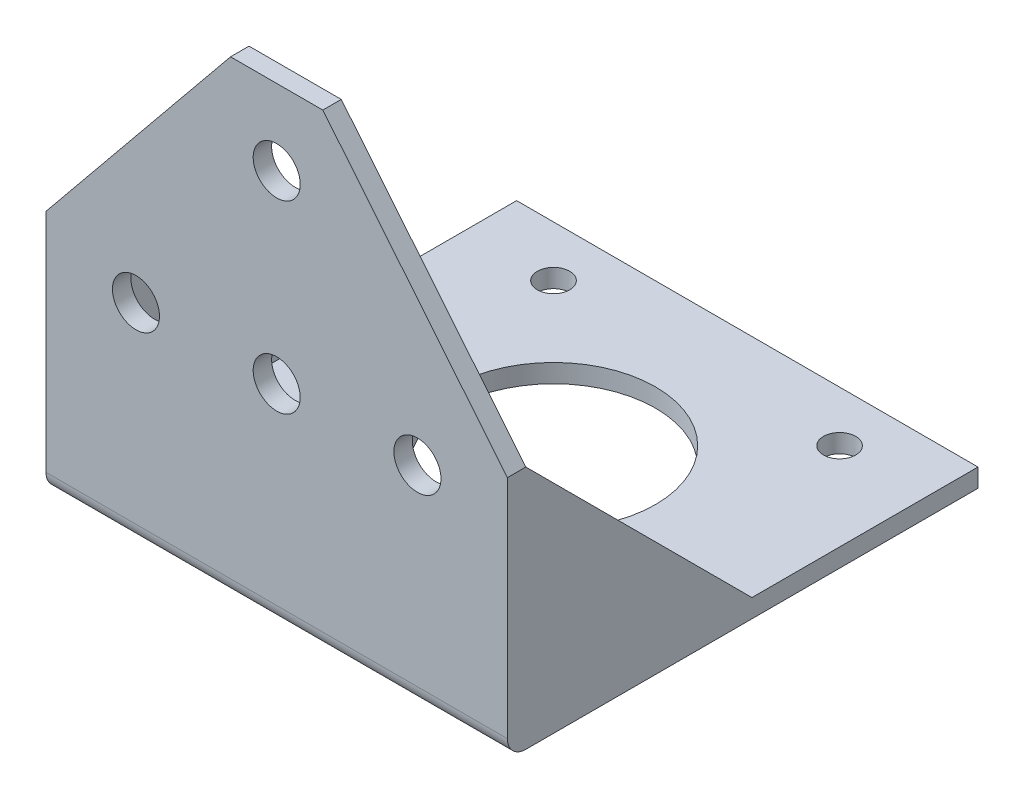
ISO-10303-21;
HEADER;
FILE_DESCRIPTION(('STEP AP214'),'2;1');
FILE_NAME('part.step','',(''),(''),'','','');
FILE_SCHEMA(('AUTOMOTIVE_DESIGN { 1 0 10303 214 1 1 1 1 }'));
ENDSEC;
DATA;
#1=APPLICATION_CONTEXT('core data for automotive mechanical design processes');
#2=APPLICATION_PROTOCOL_DEFINITION('international standard','automotive_design',2000,#1);
#3=PRODUCT_CONTEXT('',#1,'mechanical');
#4=PRODUCT('Part','Part','',(#3));
#5=PRODUCT_RELATED_PRODUCT_CATEGORY('part','',(#4));
#6=PRODUCT_DEFINITION_FORMATION('','',#4);
#7=PRODUCT_DEFINITION_CONTEXT('part definition',#1,'design');
#8=PRODUCT_DEFINITION('design','',#6,#7);
#9=PRODUCT_DEFINITION_SHAPE('','',#8);
#10=(LENGTH_UNIT() NAMED_UNIT(*) SI_UNIT(.MILLI.,.METRE.));
#11=(NAMED_UNIT(*) PLANE_ANGLE_UNIT() SI_UNIT($,.RADIAN.));
#12=(NAMED_UNIT(*) SI_UNIT($,.STERADIAN.) SOLID_ANGLE_UNIT());
#13=UNCERTAINTY_MEASURE_WITH_UNIT(LENGTH_MEASURE(1.E-05),#10,'distance_accuracy_value','');
#14=(GEOMETRIC_REPRESENTATION_CONTEXT(3) GLOBAL_UNCERTAINTY_ASSIGNED_CONTEXT((#13)) GLOBAL_UNIT_ASSIGNED_CONTEXT((#10,
#11,#12)) REPRESENTATION_CONTEXT('',''));
#15=CARTESIAN_POINT('',(0.,0.,0.));
#16=DIRECTION('',(0.,0.,1.));
#17=DIRECTION('',(1.,0.,0.));
#18=AXIS2_PLACEMENT_3D('',#15,#16,#17);
#19=CARTESIAN_POINT('',(25.,2.,-21.));
#20=DIRECTION('',(-1.,0.,0.));
#21=DIRECTION('',(0.,0.,1.));
#22=AXIS2_PLACEMENT_3D('',#19,#20,#21);
#23=PLANE('',#22);
#24=DIRECTION('',(0.,0.,-1.));
#25=VECTOR('',#24,1.);
#26=CARTESIAN_POINT('',(25.,26.5,30.));
#27=LINE('',#26,#25);
#28=CARTESIAN_POINT('',(25.,26.5,30.));
#29=VERTEX_POINT('',#28);
#30=CARTESIAN_POINT('',(25.,26.5,28.));
#31=VERTEX_POINT('',#30);
#32=EDGE_CURVE('E291',#29,#31,#27,.T.);
#33=ORIENTED_EDGE('',*,*,#32,.F.);
#34=DIRECTION('',(0.,-1.,0.));
#35=VECTOR('',#34,1.);
#36=CARTESIAN_POINT('',(25.,2.,30.));
#37=LINE('',#36,#35);
#38=CARTESIAN_POINT('',(25.,2.,30.));
#39=VERTEX_POINT('',#38);
#40=EDGE_CURVE('E154',#29,#39,#37,.T.);
#41=ORIENTED_EDGE('',*,*,#40,.T.);
#42=CARTESIAN_POINT('',(25.,2.,28.));
#43=DIRECTION('',(-1.,0.,0.));
#44=DIRECTION('',(0.,0.,1.));
#45=AXIS2_PLACEMENT_3D('',#42,#43,#44);
#46=CIRCLE('',#45,2.);
#47=CARTESIAN_POINT('',(25.,0.,28.));
#48=VERTEX_POINT('',#47);
#49=EDGE_CURVE('E184',#39,#48,#46,.F.);
#50=ORIENTED_EDGE('',*,*,#49,.T.);
#51=DIRECTION('',(0.,0.,-1.));
#52=VECTOR('',#51,1.);
#53=CARTESIAN_POINT('',(25.,0.,-21.));
#54=LINE('',#53,#52);
#55=CARTESIAN_POINT('',(25.,0.,-21.));
#56=VERTEX_POINT('',#55);
#57=EDGE_CURVE('E182',#48,#56,#54,.T.);
#58=ORIENTED_EDGE('',*,*,#57,.T.);
#59=DIRECTION('',(0.,-1.,0.));
#60=VECTOR('',#59,1.);
#61=CARTESIAN_POINT('',(25.,2.,-21.));
#62=LINE('',#61,#60);
#63=CARTESIAN_POINT('',(25.,2.,-21.));
#64=VERTEX_POINT('',#63);
#65=EDGE_CURVE('E157',#64,#56,#62,.T.);
#66=ORIENTED_EDGE('',*,*,#65,.F.);
#67=DIRECTION('',(0.,0.,-1.));
#68=VECTOR('',#67,1.);
#69=CARTESIAN_POINT('',(25.,2.,-21.));
#70=LINE('',#69,#68);
#71=CARTESIAN_POINT('',(25.,2.,3.5));
#72=VERTEX_POINT('',#71);
#73=EDGE_CURVE('E268',#72,#64,#70,.T.);
#74=ORIENTED_EDGE('',*,*,#73,.F.);
#75=DIRECTION('',(0.,0.707106781186547,0.707106781186547));
#76=VECTOR('',#75,1.);
#77=CARTESIAN_POINT('',(25.,26.5,28.));
#78=LINE('',#77,#76);
#79=EDGE_CURVE('E239',#72,#31,#78,.T.);
#80=ORIENTED_EDGE('',*,*,#79,.T.);
#81=EDGE_LOOP('',(#33,#41,#50,#58,#66,#74,#80));
#82=FACE_BOUND('',#81,.T.);
#83=ADVANCED_FACE('F35',(#82),#23,.F.);
#84=CARTESIAN_POINT('',(-25.,2.,30.));
#85=DIRECTION('',(0.,0.,-1.));
#86=DIRECTION('',(-1.,0.,0.));
#87=AXIS2_PLACEMENT_3D('',#84,#85,#86);
#88=PLANE('',#87);
#89=CARTESIAN_POINT('',(0.,22.8,30.));
#90=DIRECTION('',(0.,0.,-1.));
#91=DIRECTION('',(-1.,0.,0.));
#92=AXIS2_PLACEMENT_3D('',#89,#90,#91);
#93=CIRCLE('',#92,2.55);
#94=CARTESIAN_POINT('',(-2.55,22.8,30.));
#95=VERTEX_POINT('',#94);
#96=EDGE_CURVE('E229',#95,#95,#93,.T.);
#97=ORIENTED_EDGE('',*,*,#96,.T.);
#98=EDGE_LOOP('',(#97));
#99=FACE_BOUND('',#98,.T.);
#100=CARTESIAN_POINT('',(15.25,22.8,30.));
#101=DIRECTION('',(0.,0.,-1.));
#102=DIRECTION('',(1.,0.,0.));
#103=AXIS2_PLACEMENT_3D('',#100,#101,#102);
#104=CIRCLE('',#103,2.55);
#105=CARTESIAN_POINT('',(17.8,22.8,30.));
#106=VERTEX_POINT('',#105);
#107=EDGE_CURVE('E301',#106,#106,#104,.T.);
#108=ORIENTED_EDGE('',*,*,#107,.T.);
#109=EDGE_LOOP('',(#108));
#110=FACE_BOUND('',#109,.T.);
#111=CARTESIAN_POINT('',(0.,42.8,30.));
#112=DIRECTION('',(0.,0.,-1.));
#113=DIRECTION('',(-1.,0.,0.));
#114=AXIS2_PLACEMENT_3D('',#111,#112,#113);
#115=CIRCLE('',#114,2.55);
#116=CARTESIAN_POINT('',(-2.55000000000001,42.8,30.));
#117=VERTEX_POINT('',#116);
#118=EDGE_CURVE('E307',#117,#117,#115,.T.);
#119=ORIENTED_EDGE('',*,*,#118,.T.);
#120=EDGE_LOOP('',(#119));
#121=FACE_BOUND('',#120,.T.);
#122=CARTESIAN_POINT('',(-15.25,22.8,30.));
#123=DIRECTION('',(0.,0.,-1.));
#124=DIRECTION('',(-1.,0.,0.));
#125=AXIS2_PLACEMENT_3D('',#122,#123,#124);
#126=CIRCLE('',#125,2.55);
#127=CARTESIAN_POINT('',(-17.8,22.8,30.));
#128=VERTEX_POINT('',#127);
#129=EDGE_CURVE('E313',#128,#128,#126,.T.);
#130=ORIENTED_EDGE('',*,*,#129,.T.);
#131=EDGE_LOOP('',(#130));
#132=FACE_BOUND('',#131,.T.);
#133=DIRECTION('',(1.,0.,0.));
#134=VECTOR('',#133,1.);
#135=CARTESIAN_POINT('',(-25.,51.,30.));
#136=LINE('',#135,#134);
#137=CARTESIAN_POINT('',(-5.,51.,30.));
#138=VERTEX_POINT('',#137);
#139=CARTESIAN_POINT('',(5.,51.,30.));
#140=VERTEX_POINT('',#139);
#141=EDGE_CURVE('E146',#138,#140,#136,.T.);
#142=ORIENTED_EDGE('',*,*,#141,.F.);
#143=DIRECTION('',(-0.632376489912261,-0.774661200142519,0.));
#144=VECTOR('',#143,1.);
#145=CARTESIAN_POINT('',(-27.9842539365159,22.8442889277681,30.));
#146=LINE('',#145,#144);
#147=CARTESIAN_POINT('',(-25.,26.5,30.));
#148=VERTEX_POINT('',#147);
#149=EDGE_CURVE('E58',#138,#148,#146,.T.);
#150=ORIENTED_EDGE('',*,*,#149,.T.);
#151=DIRECTION('',(0.,-1.,0.));
#152=VECTOR('',#151,1.);
#153=CARTESIAN_POINT('',(-25.,2.,30.));
#154=LINE('',#153,#152);
#155=CARTESIAN_POINT('',(-25.,2.,30.));
#156=VERTEX_POINT('',#155);
#157=EDGE_CURVE('E142',#148,#156,#154,.T.);
#158=ORIENTED_EDGE('',*,*,#157,.T.);
#159=DIRECTION('',(1.,0.,0.));
#160=VECTOR('',#159,1.);
#161=CARTESIAN_POINT('',(-25.,2.,30.));
#162=LINE('',#161,#160);
#163=EDGE_CURVE('E165',#156,#39,#162,.T.);
#164=ORIENTED_EDGE('',*,*,#163,.T.);
#165=ORIENTED_EDGE('',*,*,#40,.F.);
#166=DIRECTION('',(0.632376489912261,-0.77466120014252,0.));
#167=VECTOR('',#166,1.);
#168=CARTESIAN_POINT('',(27.9842539365159,22.8442889277681,30.));
#169=LINE('',#168,#167);
#170=EDGE_CURVE('E287',#140,#29,#169,.T.);
#171=ORIENTED_EDGE('',*,*,#170,.F.);
#172=EDGE_LOOP('',(#142,#150,#158,#164,#165,#171));
#173=FACE_BOUND('',#172,.T.);
#174=ADVANCED_FACE('F140',(#99,#110,#121,#132,#173),#88,.F.);
#175=CARTESIAN_POINT('',(-25.,51.,28.));
#176=DIRECTION('',(0.,0.,1.));
#177=DIRECTION('',(1.,0.,0.));
#178=AXIS2_PLACEMENT_3D('',#175,#176,#177);
#179=PLANE('',#178);
#180=CARTESIAN_POINT('',(0.,22.8,28.));
#181=DIRECTION('',(0.,0.,-1.));
#182=DIRECTION('',(-1.,0.,0.));
#183=AXIS2_PLACEMENT_3D('',#180,#181,#182);
#184=CIRCLE('',#183,2.55);
#185=CARTESIAN_POINT('',(-2.55,22.8,28.));
#186=VERTEX_POINT('',#185);
#187=EDGE_CURVE('E232',#186,#186,#184,.T.);
#188=ORIENTED_EDGE('',*,*,#187,.F.);
#189=EDGE_LOOP('',(#188));
#190=FACE_BOUND('',#189,.T.);
#191=CARTESIAN_POINT('',(15.25,22.8,28.));
#192=DIRECTION('',(0.,0.,-1.));
#193=DIRECTION('',(1.,0.,0.));
#194=AXIS2_PLACEMENT_3D('',#191,#192,#193);
#195=CIRCLE('',#194,2.55);
#196=CARTESIAN_POINT('',(17.8,22.8,28.));
#197=VERTEX_POINT('',#196);
#198=EDGE_CURVE('E135',#197,#197,#195,.T.);
#199=ORIENTED_EDGE('',*,*,#198,.F.);
#200=EDGE_LOOP('',(#199));
#201=FACE_BOUND('',#200,.T.);
#202=CARTESIAN_POINT('',(0.,42.8,28.));
#203=DIRECTION('',(0.,0.,-1.));
#204=DIRECTION('',(-1.,0.,0.));
#205=AXIS2_PLACEMENT_3D('',#202,#203,#204);
#206=CIRCLE('',#205,2.55);
#207=CARTESIAN_POINT('',(-2.55000000000001,42.8,28.));
#208=VERTEX_POINT('',#207);
#209=EDGE_CURVE('E310',#208,#208,#206,.T.);
#210=ORIENTED_EDGE('',*,*,#209,.F.);
#211=EDGE_LOOP('',(#210));
#212=FACE_BOUND('',#211,.T.);
#213=CARTESIAN_POINT('',(-15.25,22.8,28.));
#214=DIRECTION('',(0.,0.,-1.));
#215=DIRECTION('',(-1.,0.,0.));
#216=AXIS2_PLACEMENT_3D('',#213,#214,#215);
#217=CIRCLE('',#216,2.55);
#218=CARTESIAN_POINT('',(-17.8,22.8,28.));
#219=VERTEX_POINT('',#218);
#220=EDGE_CURVE('E304',#219,#219,#217,.T.);
#221=ORIENTED_EDGE('',*,*,#220,.F.);
#222=EDGE_LOOP('',(#221));
#223=FACE_BOUND('',#222,.T.);
#224=DIRECTION('',(-1.,0.,0.));
#225=VECTOR('',#224,1.);
#226=CARTESIAN_POINT('',(-23.,26.5,28.));
#227=LINE('',#226,#225);
#228=CARTESIAN_POINT('',(-23.,26.5,28.));
#229=VERTEX_POINT('',#228);
#230=CARTESIAN_POINT('',(-25.,26.5,28.));
#231=VERTEX_POINT('',#230);
#232=EDGE_CURVE('E235',#229,#231,#227,.T.);
#233=ORIENTED_EDGE('',*,*,#232,.T.);
#234=DIRECTION('',(-0.632376489912261,-0.774661200142519,0.));
#235=VECTOR('',#234,1.);
#236=CARTESIAN_POINT('',(-27.9842539365159,22.8442889277681,28.));
#237=LINE('',#236,#235);
#238=CARTESIAN_POINT('',(-5.,51.,28.));
#239=VERTEX_POINT('',#238);
#240=EDGE_CURVE('E130',#239,#231,#237,.T.);
#241=ORIENTED_EDGE('',*,*,#240,.F.);
#242=DIRECTION('',(-1.,0.,0.));
#243=VECTOR('',#242,1.);
#244=CARTESIAN_POINT('',(-25.,51.,28.));
#245=LINE('',#244,#243);
#246=CARTESIAN_POINT('',(5.,51.,28.));
#247=VERTEX_POINT('',#246);
#248=EDGE_CURVE('E251',#247,#239,#245,.T.);
#249=ORIENTED_EDGE('',*,*,#248,.F.);
#250=DIRECTION('',(0.632376489912261,-0.77466120014252,0.));
#251=VECTOR('',#250,1.);
#252=CARTESIAN_POINT('',(27.9842539365159,22.8442889277681,28.));
#253=LINE('',#252,#251);
#254=EDGE_CURVE('E50',#247,#31,#253,.T.);
#255=ORIENTED_EDGE('',*,*,#254,.T.);
#256=DIRECTION('',(1.,0.,0.));
#257=VECTOR('',#256,1.);
#258=CARTESIAN_POINT('',(23.,26.5,28.));
#259=LINE('',#258,#257);
#260=CARTESIAN_POINT('',(23.,26.5,28.));
#261=VERTEX_POINT('',#260);
#262=EDGE_CURVE('E246',#261,#31,#259,.T.);
#263=ORIENTED_EDGE('',*,*,#262,.F.);
#264=DIRECTION('',(0.,-1.,0.));
#265=VECTOR('',#264,1.);
#266=CARTESIAN_POINT('',(23.,2.,28.));
#267=LINE('',#266,#265);
#268=CARTESIAN_POINT('',(23.,4.,28.));
#269=VERTEX_POINT('',#268);
#270=EDGE_CURVE('E213',#261,#269,#267,.T.);
#271=ORIENTED_EDGE('',*,*,#270,.T.);
#272=DIRECTION('',(-1.,0.,0.));
#273=VECTOR('',#272,1.);
#274=CARTESIAN_POINT('',(-25.,4.,28.));
#275=LINE('',#274,#273);
#276=CARTESIAN_POINT('',(-23.,4.,28.));
#277=VERTEX_POINT('',#276);
#278=EDGE_CURVE('E189',#269,#277,#275,.T.);
#279=ORIENTED_EDGE('',*,*,#278,.T.);
#280=DIRECTION('',(0.,1.,0.));
#281=VECTOR('',#280,1.);
#282=CARTESIAN_POINT('',(-23.,2.,28.));
#283=LINE('',#282,#281);
#284=EDGE_CURVE('E220',#277,#229,#283,.T.);
#285=ORIENTED_EDGE('',*,*,#284,.T.);
#286=EDGE_LOOP('',(#233,#241,#249,#255,#263,#271,#279,#285));
#287=FACE_BOUND('',#286,.T.);
#288=ADVANCED_FACE('F219',(#190,#201,#212,#223,#287),#179,.F.);
#289=CARTESIAN_POINT('',(0.,51.,0.));
#290=DIRECTION('',(0.,-1.,0.));
#291=DIRECTION('',(0.,0.,-1.));
#292=AXIS2_PLACEMENT_3D('',#289,#290,#291);
#293=PLANE('',#292);
#294=ORIENTED_EDGE('',*,*,#248,.T.);
#295=DIRECTION('',(0.,0.,-1.));
#296=VECTOR('',#295,1.);
#297=CARTESIAN_POINT('',(-5.,51.,30.));
#298=LINE('',#297,#296);
#299=EDGE_CURVE('E136',#138,#239,#298,.T.);
#300=ORIENTED_EDGE('',*,*,#299,.F.);
#301=ORIENTED_EDGE('',*,*,#141,.T.);
#302=DIRECTION('',(0.,0.,-1.));
#303=VECTOR('',#302,1.);
#304=CARTESIAN_POINT('',(5.,51.,30.));
#305=LINE('',#304,#303);
#306=EDGE_CURVE('E294',#140,#247,#305,.T.);
#307=ORIENTED_EDGE('',*,*,#306,.T.);
#308=EDGE_LOOP('',(#294,#300,#301,#307));
#309=FACE_BOUND('',#308,.T.);
#310=ADVANCED_FACE('F327',(#309),#293,.F.);
#311=CARTESIAN_POINT('',(-25.,2.,-21.));
#312=DIRECTION('',(0.,0.,1.));
#313=DIRECTION('',(1.,0.,0.));
#314=AXIS2_PLACEMENT_3D('',#311,#312,#313);
#315=PLANE('',#314);
#316=DIRECTION('',(-1.,0.,0.));
#317=VECTOR('',#316,1.);
#318=CARTESIAN_POINT('',(-25.,0.,-21.));
#319=LINE('',#318,#317);
#320=CARTESIAN_POINT('',(-25.,0.,-21.));
#321=VERTEX_POINT('',#320);
#322=EDGE_CURVE('E276',#56,#321,#319,.T.);
#323=ORIENTED_EDGE('',*,*,#322,.T.);
#324=DIRECTION('',(0.,-1.,0.));
#325=VECTOR('',#324,1.);
#326=CARTESIAN_POINT('',(-25.,2.,-21.));
#327=LINE('',#326,#325);
#328=CARTESIAN_POINT('',(-25.,2.,-21.));
#329=VERTEX_POINT('',#328);
#330=EDGE_CURVE('E153',#329,#321,#327,.T.);
#331=ORIENTED_EDGE('',*,*,#330,.F.);
#332=DIRECTION('',(-1.,0.,0.));
#333=VECTOR('',#332,1.);
#334=CARTESIAN_POINT('',(-25.,2.,-21.));
#335=LINE('',#334,#333);
#336=EDGE_CURVE('E270',#64,#329,#335,.T.);
#337=ORIENTED_EDGE('',*,*,#336,.F.);
#338=ORIENTED_EDGE('',*,*,#65,.T.);
#339=EDGE_LOOP('',(#323,#331,#337,#338));
#340=FACE_BOUND('',#339,.T.);
#341=ADVANCED_FACE('F356',(#340),#315,.F.);
#342=CARTESIAN_POINT('',(-25.,2.,-21.));
#343=DIRECTION('',(1.,0.,0.));
#344=DIRECTION('',(0.,0.,-1.));
#345=AXIS2_PLACEMENT_3D('',#342,#343,#344);
#346=PLANE('',#345);
#347=ORIENTED_EDGE('',*,*,#157,.F.);
#348=DIRECTION('',(0.,0.,-1.));
#349=VECTOR('',#348,1.);
#350=CARTESIAN_POINT('',(-25.,26.5,30.));
#351=LINE('',#350,#349);
#352=EDGE_CURVE('E127',#148,#231,#351,.T.);
#353=ORIENTED_EDGE('',*,*,#352,.T.);
#354=DIRECTION('',(0.,-0.707106781186547,-0.707106781186547));
#355=VECTOR('',#354,1.);
#356=CARTESIAN_POINT('',(-25.,26.5,28.));
#357=LINE('',#356,#355);
#358=CARTESIAN_POINT('',(-25.,2.,3.5));
#359=VERTEX_POINT('',#358);
#360=EDGE_CURVE('E226',#231,#359,#357,.T.);
#361=ORIENTED_EDGE('',*,*,#360,.T.);
#362=DIRECTION('',(0.,0.,1.));
#363=VECTOR('',#362,1.);
#364=CARTESIAN_POINT('',(-25.,2.,-21.));
#365=LINE('',#364,#363);
#366=EDGE_CURVE('E159',#329,#359,#365,.T.);
#367=ORIENTED_EDGE('',*,*,#366,.F.);
#368=ORIENTED_EDGE('',*,*,#330,.T.);
#369=DIRECTION('',(0.,0.,1.));
#370=VECTOR('',#369,1.);
#371=CARTESIAN_POINT('',(-25.,0.,-21.));
#372=LINE('',#371,#370);
#373=CARTESIAN_POINT('',(-25.,0.,28.));
#374=VERTEX_POINT('',#373);
#375=EDGE_CURVE('E271',#321,#374,#372,.T.);
#376=ORIENTED_EDGE('',*,*,#375,.T.);
#377=CARTESIAN_POINT('',(-25.,2.,28.));
#378=DIRECTION('',(1.,0.,0.));
#379=DIRECTION('',(0.,0.,-1.));
#380=AXIS2_PLACEMENT_3D('',#377,#378,#379);
#381=CIRCLE('',#380,2.);
#382=EDGE_CURVE('E151',#374,#156,#381,.F.);
#383=ORIENTED_EDGE('',*,*,#382,.T.);
#384=EDGE_LOOP('',(#347,#353,#361,#367,#368,#376,#383));
#385=FACE_BOUND('',#384,.T.);
#386=ADVANCED_FACE('F148',(#385),#346,.F.);
#387=CARTESIAN_POINT('',(0.,2.,0.));
#388=DIRECTION('',(0.,1.,0.));
#389=DIRECTION('',(0.,0.,1.));
#390=AXIS2_PLACEMENT_3D('',#387,#388,#389);
#391=PLANE('',#390);
#392=DIRECTION('',(0.,0.,1.));
#393=VECTOR('',#392,1.);
#394=CARTESIAN_POINT('',(-23.,2.,3.5));
#395=LINE('',#394,#393);
#396=CARTESIAN_POINT('',(-23.,2.,3.5));
#397=VERTEX_POINT('',#396);
#398=CARTESIAN_POINT('',(-23.,2.,26.));
#399=VERTEX_POINT('',#398);
#400=EDGE_CURVE('E203',#397,#399,#395,.T.);
#401=ORIENTED_EDGE('',*,*,#400,.T.);
#402=DIRECTION('',(-1.,0.,0.));
#403=VECTOR('',#402,1.);
#404=CARTESIAN_POINT('',(0.,2.,26.));
#405=LINE('',#404,#403);
#406=CARTESIAN_POINT('',(23.,2.,26.));
#407=VERTEX_POINT('',#406);
#408=EDGE_CURVE('E43',#399,#407,#405,.F.);
#409=ORIENTED_EDGE('',*,*,#408,.T.);
#410=DIRECTION('',(0.,0.,-1.));
#411=VECTOR('',#410,1.);
#412=CARTESIAN_POINT('',(23.,2.,3.5));
#413=LINE('',#412,#411);
#414=CARTESIAN_POINT('',(23.,2.,3.5));
#415=VERTEX_POINT('',#414);
#416=EDGE_CURVE('E199',#407,#415,#413,.T.);
#417=ORIENTED_EDGE('',*,*,#416,.T.);
#418=DIRECTION('',(1.,0.,0.));
#419=VECTOR('',#418,1.);
#420=CARTESIAN_POINT('',(23.,2.,3.5));
#421=LINE('',#420,#419);
#422=EDGE_CURVE('E243',#415,#72,#421,.T.);
#423=ORIENTED_EDGE('',*,*,#422,.T.);
#424=ORIENTED_EDGE('',*,*,#73,.T.);
#425=ORIENTED_EDGE('',*,*,#336,.T.);
#426=ORIENTED_EDGE('',*,*,#366,.T.);
#427=DIRECTION('',(-1.,0.,0.));
#428=VECTOR('',#427,1.);
#429=CARTESIAN_POINT('',(-23.,2.,3.5));
#430=LINE('',#429,#428);
#431=EDGE_CURVE('E237',#397,#359,#430,.T.);
#432=ORIENTED_EDGE('',*,*,#431,.F.);
#433=EDGE_LOOP('',(#401,#409,#417,#423,#424,#425,#426,#432));
#434=FACE_BOUND('',#433,.T.);
#435=CARTESIAN_POINT('',(15.5,2.,-15.5));
#436=DIRECTION('',(0.,1.,0.));
#437=DIRECTION('',(0.,0.,-1.));
#438=AXIS2_PLACEMENT_3D('',#435,#436,#437);
#439=CIRCLE('',#438,1.75);
#440=CARTESIAN_POINT('',(15.5,2.,-17.25));
#441=VERTEX_POINT('',#440);
#442=EDGE_CURVE('E254',#441,#441,#439,.T.);
#443=ORIENTED_EDGE('',*,*,#442,.F.);
#444=EDGE_LOOP('',(#443));
#445=FACE_BOUND('',#444,.T.);
#446=CARTESIAN_POINT('',(15.5,2.,15.5));
#447=DIRECTION('',(0.,1.,0.));
#448=DIRECTION('',(0.,0.,-1.));
#449=AXIS2_PLACEMENT_3D('',#446,#447,#448);
#450=CIRCLE('',#449,1.75);
#451=CARTESIAN_POINT('',(15.5,2.,13.75));
#452=VERTEX_POINT('',#451);
#453=EDGE_CURVE('E261',#452,#452,#450,.T.);
#454=ORIENTED_EDGE('',*,*,#453,.F.);
#455=EDGE_LOOP('',(#454));
#456=FACE_BOUND('',#455,.T.);
#457=CARTESIAN_POINT('',(-15.5,2.,15.5));
#458=DIRECTION('',(0.,1.,0.));
#459=DIRECTION('',(0.,0.,1.));
#460=AXIS2_PLACEMENT_3D('',#457,#458,#459);
#461=CIRCLE('',#460,1.75);
#462=CARTESIAN_POINT('',(-15.5,2.,17.25));
#463=VERTEX_POINT('',#462);
#464=EDGE_CURVE('E258',#463,#463,#461,.T.);
#465=ORIENTED_EDGE('',*,*,#464,.F.);
#466=EDGE_LOOP('',(#465));
#467=FACE_BOUND('',#466,.T.);
#468=CARTESIAN_POINT('',(-15.5,2.,-15.5));
#469=DIRECTION('',(0.,1.,0.));
#470=DIRECTION('',(0.,0.,1.));
#471=AXIS2_PLACEMENT_3D('',#468,#469,#470);
#472=CIRCLE('',#471,1.75);
#473=CARTESIAN_POINT('',(-15.5,2.,-13.75));
#474=VERTEX_POINT('',#473);
#475=EDGE_CURVE('E255',#474,#474,#472,.T.);
#476=ORIENTED_EDGE('',*,*,#475,.F.);
#477=EDGE_LOOP('',(#476));
#478=FACE_BOUND('',#477,.T.);
#479=CARTESIAN_POINT('',(0.,2.,0.));
#480=DIRECTION('',(0.,1.,0.));
#481=DIRECTION('',(0.,0.,1.));
#482=AXIS2_PLACEMENT_3D('',#479,#480,#481);
#483=CIRCLE('',#482,11.05);
#484=CARTESIAN_POINT('',(0.,2.,11.05));
#485=VERTEX_POINT('',#484);
#486=EDGE_CURVE('E170',#485,#485,#483,.T.);
#487=ORIENTED_EDGE('',*,*,#486,.F.);
#488=EDGE_LOOP('',(#487));
#489=FACE_BOUND('',#488,.T.);
#490=ADVANCED_FACE('F197',(#434,#445,#456,#467,#478,#489),#391,.T.);
#491=CARTESIAN_POINT('',(0.,0.,0.));
#492=DIRECTION('',(0.,1.,0.));
#493=DIRECTION('',(0.,0.,1.));
#494=AXIS2_PLACEMENT_3D('',#491,#492,#493);
#495=PLANE('',#494);
#496=CARTESIAN_POINT('',(15.5,0.,-15.5));
#497=DIRECTION('',(0.,1.,0.));
#498=DIRECTION('',(0.,0.,1.));
#499=AXIS2_PLACEMENT_3D('',#496,#497,#498);
#500=CIRCLE('',#499,1.75);
#501=CARTESIAN_POINT('',(15.5,0.,-13.75));
#502=VERTEX_POINT('',#501);
#503=EDGE_CURVE('E179',#502,#502,#500,.T.);
#504=ORIENTED_EDGE('',*,*,#503,.T.);
#505=EDGE_LOOP('',(#504));
#506=FACE_BOUND('',#505,.T.);
#507=CARTESIAN_POINT('',(15.5,0.,15.5));
#508=DIRECTION('',(0.,1.,0.));
#509=DIRECTION('',(0.,0.,1.));
#510=AXIS2_PLACEMENT_3D('',#507,#508,#509);
#511=CIRCLE('',#510,1.75);
#512=CARTESIAN_POINT('',(15.5,0.,17.25));
#513=VERTEX_POINT('',#512);
#514=EDGE_CURVE('E176',#513,#513,#511,.T.);
#515=ORIENTED_EDGE('',*,*,#514,.T.);
#516=EDGE_LOOP('',(#515));
#517=FACE_BOUND('',#516,.T.);
#518=CARTESIAN_POINT('',(-15.5,0.,15.5));
#519=DIRECTION('',(0.,1.,0.));
#520=DIRECTION('',(0.,0.,1.));
#521=AXIS2_PLACEMENT_3D('',#518,#519,#520);
#522=CIRCLE('',#521,1.75);
#523=CARTESIAN_POINT('',(-15.5,0.,17.25));
#524=VERTEX_POINT('',#523);
#525=EDGE_CURVE('E173',#524,#524,#522,.T.);
#526=ORIENTED_EDGE('',*,*,#525,.T.);
#527=EDGE_LOOP('',(#526));
#528=FACE_BOUND('',#527,.T.);
#529=CARTESIAN_POINT('',(-15.5,0.,-15.5));
#530=DIRECTION('',(0.,1.,0.));
#531=DIRECTION('',(0.,0.,1.));
#532=AXIS2_PLACEMENT_3D('',#529,#530,#531);
#533=CIRCLE('',#532,1.75);
#534=CARTESIAN_POINT('',(-15.5,0.,-13.75));
#535=VERTEX_POINT('',#534);
#536=EDGE_CURVE('E169',#535,#535,#533,.T.);
#537=ORIENTED_EDGE('',*,*,#536,.T.);
#538=EDGE_LOOP('',(#537));
#539=FACE_BOUND('',#538,.T.);
#540=CARTESIAN_POINT('',(0.,0.,0.));
#541=DIRECTION('',(0.,1.,0.));
#542=DIRECTION('',(0.,0.,1.));
#543=AXIS2_PLACEMENT_3D('',#540,#541,#542);
#544=CIRCLE('',#543,11.05);
#545=CARTESIAN_POINT('',(0.,0.,11.05));
#546=VERTEX_POINT('',#545);
#547=EDGE_CURVE('E166',#546,#546,#544,.T.);
#548=ORIENTED_EDGE('',*,*,#547,.T.);
#549=EDGE_LOOP('',(#548));
#550=FACE_BOUND('',#549,.T.);
#551=ORIENTED_EDGE('',*,*,#57,.F.);
#552=DIRECTION('',(1.,0.,0.));
#553=VECTOR('',#552,1.);
#554=CARTESIAN_POINT('',(0.,0.,28.));
#555=LINE('',#554,#553);
#556=EDGE_CURVE('E186',#48,#374,#555,.F.);
#557=ORIENTED_EDGE('',*,*,#556,.T.);
#558=ORIENTED_EDGE('',*,*,#375,.F.);
#559=ORIENTED_EDGE('',*,*,#322,.F.);
#560=EDGE_LOOP('',(#551,#557,#558,#559));
#561=FACE_BOUND('',#560,.T.);
#562=ADVANCED_FACE('F362',(#506,#517,#528,#539,#550,#561),#495,.F.);
#563=CARTESIAN_POINT('',(0.,-1.,0.));
#564=DIRECTION('',(0.,1.,0.));
#565=DIRECTION('',(0.,0.,1.));
#566=AXIS2_PLACEMENT_3D('',#563,#564,#565);
#567=CYLINDRICAL_SURFACE('',#566,11.05);
#568=ORIENTED_EDGE('',*,*,#486,.T.);
#569=EDGE_LOOP('',(#568));
#570=FACE_BOUND('',#569,.T.);
#571=ORIENTED_EDGE('',*,*,#547,.F.);
#572=EDGE_LOOP('',(#571));
#573=FACE_BOUND('',#572,.T.);
#574=ADVANCED_FACE('F365',(#570,#573),#567,.F.);
#575=CARTESIAN_POINT('',(-15.5,-1.,-15.5));
#576=DIRECTION('',(0.,1.,0.));
#577=DIRECTION('',(0.,0.,1.));
#578=AXIS2_PLACEMENT_3D('',#575,#576,#577);
#579=CYLINDRICAL_SURFACE('',#578,1.75);
#580=ORIENTED_EDGE('',*,*,#475,.T.);
#581=EDGE_LOOP('',(#580));
#582=FACE_BOUND('',#581,.T.);
#583=ORIENTED_EDGE('',*,*,#536,.F.);
#584=EDGE_LOOP('',(#583));
#585=FACE_BOUND('',#584,.T.);
#586=ADVANCED_FACE('F371',(#582,#585),#579,.F.);
#587=CARTESIAN_POINT('',(-15.5,-1.,15.5));
#588=DIRECTION('',(0.,1.,0.));
#589=DIRECTION('',(0.,0.,1.));
#590=AXIS2_PLACEMENT_3D('',#587,#588,#589);
#591=CYLINDRICAL_SURFACE('',#590,1.75);
#592=ORIENTED_EDGE('',*,*,#464,.T.);
#593=EDGE_LOOP('',(#592));
#594=FACE_BOUND('',#593,.T.);
#595=ORIENTED_EDGE('',*,*,#525,.F.);
#596=EDGE_LOOP('',(#595));
#597=FACE_BOUND('',#596,.T.);
#598=ADVANCED_FACE('F381',(#594,#597),#591,.F.);
#599=CARTESIAN_POINT('',(15.5,-1.,15.5));
#600=DIRECTION('',(0.,1.,0.));
#601=DIRECTION('',(0.,0.,1.));
#602=AXIS2_PLACEMENT_3D('',#599,#600,#601);
#603=CYLINDRICAL_SURFACE('',#602,1.75);
#604=ORIENTED_EDGE('',*,*,#453,.T.);
#605=EDGE_LOOP('',(#604));
#606=FACE_BOUND('',#605,.T.);
#607=ORIENTED_EDGE('',*,*,#514,.F.);
#608=EDGE_LOOP('',(#607));
#609=FACE_BOUND('',#608,.T.);
#610=ADVANCED_FACE('F377',(#606,#609),#603,.F.);
#611=CARTESIAN_POINT('',(15.5,-1.,-15.5));
#612=DIRECTION('',(0.,1.,0.));
#613=DIRECTION('',(0.,0.,1.));
#614=AXIS2_PLACEMENT_3D('',#611,#612,#613);
#615=CYLINDRICAL_SURFACE('',#614,1.75);
#616=ORIENTED_EDGE('',*,*,#442,.T.);
#617=EDGE_LOOP('',(#616));
#618=FACE_BOUND('',#617,.T.);
#619=ORIENTED_EDGE('',*,*,#503,.F.);
#620=EDGE_LOOP('',(#619));
#621=FACE_BOUND('',#620,.T.);
#622=ADVANCED_FACE('F373',(#618,#621),#615,.F.);
#623=CARTESIAN_POINT('',(23.,26.5,28.));
#624=DIRECTION('',(0.,0.707106781186547,-0.707106781186547));
#625=DIRECTION('',(0.,0.707106781186548,0.707106781186548));
#626=AXIS2_PLACEMENT_3D('',#623,#624,#625);
#627=PLANE('',#626);
#628=ORIENTED_EDGE('',*,*,#79,.F.);
#629=ORIENTED_EDGE('',*,*,#422,.F.);
#630=DIRECTION('',(0.,0.707106781186547,0.707106781186547));
#631=VECTOR('',#630,1.);
#632=CARTESIAN_POINT('',(23.,26.5,28.));
#633=LINE('',#632,#631);
#634=EDGE_CURVE('E212',#415,#261,#633,.T.);
#635=ORIENTED_EDGE('',*,*,#634,.T.);
#636=ORIENTED_EDGE('',*,*,#262,.T.);
#637=EDGE_LOOP('',(#628,#629,#635,#636));
#638=FACE_BOUND('',#637,.T.);
#639=ADVANCED_FACE('F376',(#638),#627,.T.);
#640=CARTESIAN_POINT('',(23.,0.,0.));
#641=DIRECTION('',(1.,0.,0.));
#642=DIRECTION('',(0.,0.,-1.));
#643=AXIS2_PLACEMENT_3D('',#640,#641,#642);
#644=PLANE('',#643);
#645=ORIENTED_EDGE('',*,*,#416,.F.);
#646=CARTESIAN_POINT('',(23.,4.,26.));
#647=DIRECTION('',(1.,0.,0.));
#648=DIRECTION('',(0.,0.,-1.));
#649=AXIS2_PLACEMENT_3D('',#646,#647,#648);
#650=CIRCLE('',#649,2.);
#651=EDGE_CURVE('E11',#407,#269,#650,.F.);
#652=ORIENTED_EDGE('',*,*,#651,.T.);
#653=ORIENTED_EDGE('',*,*,#270,.F.);
#654=ORIENTED_EDGE('',*,*,#634,.F.);
#655=EDGE_LOOP('',(#645,#652,#653,#654));
#656=FACE_BOUND('',#655,.T.);
#657=ADVANCED_FACE('F208',(#656),#644,.F.);
#658=CARTESIAN_POINT('',(-23.,26.5,28.));
#659=DIRECTION('',(0.,0.707106781186548,-0.707106781186548));
#660=DIRECTION('',(0.,0.707106781186548,0.707106781186547));
#661=AXIS2_PLACEMENT_3D('',#658,#659,#660);
#662=PLANE('',#661);
#663=ORIENTED_EDGE('',*,*,#360,.F.);
#664=ORIENTED_EDGE('',*,*,#232,.F.);
#665=DIRECTION('',(0.,-0.707106781186547,-0.707106781186547));
#666=VECTOR('',#665,1.);
#667=CARTESIAN_POINT('',(-23.,26.5,28.));
#668=LINE('',#667,#666);
#669=EDGE_CURVE('E225',#229,#397,#668,.T.);
#670=ORIENTED_EDGE('',*,*,#669,.T.);
#671=ORIENTED_EDGE('',*,*,#431,.T.);
#672=EDGE_LOOP('',(#663,#664,#670,#671));
#673=FACE_BOUND('',#672,.T.);
#674=ADVANCED_FACE('F397',(#673),#662,.T.);
#675=CARTESIAN_POINT('',(-23.,0.,0.));
#676=DIRECTION('',(1.,0.,0.));
#677=DIRECTION('',(0.,0.,-1.));
#678=AXIS2_PLACEMENT_3D('',#675,#676,#677);
#679=PLANE('',#678);
#680=ORIENTED_EDGE('',*,*,#284,.F.);
#681=CARTESIAN_POINT('',(-23.,4.,26.));
#682=DIRECTION('',(1.,0.,0.));
#683=DIRECTION('',(0.,0.,-1.));
#684=AXIS2_PLACEMENT_3D('',#681,#682,#683);
#685=CIRCLE('',#684,2.);
#686=EDGE_CURVE('E192',#277,#399,#685,.T.);
#687=ORIENTED_EDGE('',*,*,#686,.T.);
#688=ORIENTED_EDGE('',*,*,#400,.F.);
#689=ORIENTED_EDGE('',*,*,#669,.F.);
#690=EDGE_LOOP('',(#680,#687,#688,#689));
#691=FACE_BOUND('',#690,.T.);
#692=ADVANCED_FACE('F224',(#691),#679,.T.);
#693=CARTESIAN_POINT('',(0.,22.8,30.));
#694=DIRECTION('',(0.,0.,-1.));
#695=DIRECTION('',(-1.,0.,0.));
#696=AXIS2_PLACEMENT_3D('',#693,#694,#695);
#697=CYLINDRICAL_SURFACE('',#696,2.55);
#698=ORIENTED_EDGE('',*,*,#96,.F.);
#699=EDGE_LOOP('',(#698));
#700=FACE_BOUND('',#699,.T.);
#701=ORIENTED_EDGE('',*,*,#187,.T.);
#702=EDGE_LOOP('',(#701));
#703=FACE_BOUND('',#702,.T.);
#704=ADVANCED_FACE('F323',(#700,#703),#697,.F.);
#705=CARTESIAN_POINT('',(15.25,22.8,30.));
#706=DIRECTION('',(0.,0.,-1.));
#707=DIRECTION('',(-1.,0.,0.));
#708=AXIS2_PLACEMENT_3D('',#705,#706,#707);
#709=CYLINDRICAL_SURFACE('',#708,2.55);
#710=ORIENTED_EDGE('',*,*,#107,.F.);
#711=EDGE_LOOP('',(#710));
#712=FACE_BOUND('',#711,.T.);
#713=ORIENTED_EDGE('',*,*,#198,.T.);
#714=EDGE_LOOP('',(#713));
#715=FACE_BOUND('',#714,.T.);
#716=ADVANCED_FACE('F344',(#712,#715),#709,.F.);
#717=CARTESIAN_POINT('',(0.,42.8,30.));
#718=DIRECTION('',(0.,0.,-1.));
#719=DIRECTION('',(-1.,0.,0.));
#720=AXIS2_PLACEMENT_3D('',#717,#718,#719);
#721=CYLINDRICAL_SURFACE('',#720,2.55);
#722=ORIENTED_EDGE('',*,*,#118,.F.);
#723=EDGE_LOOP('',(#722));
#724=FACE_BOUND('',#723,.T.);
#725=ORIENTED_EDGE('',*,*,#209,.T.);
#726=EDGE_LOOP('',(#725));
#727=FACE_BOUND('',#726,.T.);
#728=ADVANCED_FACE('F337',(#724,#727),#721,.F.);
#729=CARTESIAN_POINT('',(-15.25,22.8,30.));
#730=DIRECTION('',(0.,0.,-1.));
#731=DIRECTION('',(-1.,0.,0.));
#732=AXIS2_PLACEMENT_3D('',#729,#730,#731);
#733=CYLINDRICAL_SURFACE('',#732,2.55);
#734=ORIENTED_EDGE('',*,*,#129,.F.);
#735=EDGE_LOOP('',(#734));
#736=FACE_BOUND('',#735,.T.);
#737=ORIENTED_EDGE('',*,*,#220,.T.);
#738=EDGE_LOOP('',(#737));
#739=FACE_BOUND('',#738,.T.);
#740=ADVANCED_FACE('F335',(#736,#739),#733,.F.);
#741=CARTESIAN_POINT('',(-25.,2.,28.));
#742=DIRECTION('',(1.,0.,0.));
#743=DIRECTION('',(0.,0.,-1.));
#744=AXIS2_PLACEMENT_3D('',#741,#742,#743);
#745=CYLINDRICAL_SURFACE('',#744,2.);
#746=ORIENTED_EDGE('',*,*,#382,.F.);
#747=ORIENTED_EDGE('',*,*,#556,.F.);
#748=ORIENTED_EDGE('',*,*,#49,.F.);
#749=ORIENTED_EDGE('',*,*,#163,.F.);
#750=EDGE_LOOP('',(#746,#747,#748,#749));
#751=FACE_BOUND('',#750,.T.);
#752=ADVANCED_FACE('F284',(#751),#745,.T.);
#753=CARTESIAN_POINT('',(-25.,4.,26.));
#754=DIRECTION('',(-1.,0.,0.));
#755=DIRECTION('',(0.,0.,1.));
#756=AXIS2_PLACEMENT_3D('',#753,#754,#755);
#757=CYLINDRICAL_SURFACE('',#756,2.);
#758=ORIENTED_EDGE('',*,*,#651,.F.);
#759=ORIENTED_EDGE('',*,*,#408,.F.);
#760=ORIENTED_EDGE('',*,*,#686,.F.);
#761=ORIENTED_EDGE('',*,*,#278,.F.);
#762=EDGE_LOOP('',(#758,#759,#760,#761));
#763=FACE_BOUND('',#762,.T.);
#764=ADVANCED_FACE('F37',(#763),#757,.F.);
#765=CARTESIAN_POINT('',(27.9842539365159,22.8442889277681,30.));
#766=DIRECTION('',(0.774661200142519,0.632376489912261,0.));
#767=DIRECTION('',(-0.632376489912261,0.77466120014252,0.));
#768=AXIS2_PLACEMENT_3D('',#765,#766,#767);
#769=PLANE('',#768);
#770=ORIENTED_EDGE('',*,*,#254,.F.);
#771=ORIENTED_EDGE('',*,*,#306,.F.);
#772=ORIENTED_EDGE('',*,*,#170,.T.);
#773=ORIENTED_EDGE('',*,*,#32,.T.);
#774=EDGE_LOOP('',(#770,#771,#772,#773));
#775=FACE_BOUND('',#774,.T.);
#776=ADVANCED_FACE('F414',(#775),#769,.T.);
#777=CARTESIAN_POINT('',(-27.9842539365159,22.8442889277681,30.));
#778=DIRECTION('',(0.774661200142519,-0.632376489912261,0.));
#779=DIRECTION('',(0.632376489912261,0.774661200142519,0.));
#780=AXIS2_PLACEMENT_3D('',#777,#778,#779);
#781=PLANE('',#780);
#782=ORIENTED_EDGE('',*,*,#240,.T.);
#783=ORIENTED_EDGE('',*,*,#352,.F.);
#784=ORIENTED_EDGE('',*,*,#149,.F.);
#785=ORIENTED_EDGE('',*,*,#299,.T.);
#786=EDGE_LOOP('',(#782,#783,#784,#785));
#787=FACE_BOUND('',#786,.T.);
#788=ADVANCED_FACE('F128',(#787),#781,.F.);
#789=CLOSED_SHELL('',(#83,#174,#288,#310,#341,#386,#490,#562,#574,#586,#598,#610,#622,#639,#657,
#674,#692,#704,#716,#728,#740,#752,#764,#776,#788));
#790=MANIFOLD_SOLID_BREP('B2',#789);
#791=ADVANCED_BREP_SHAPE_REPRESENTATION('',(#18,#790),#14);
#792=SHAPE_DEFINITION_REPRESENTATION(#9,#791);
ENDSEC;
END-ISO-10303-21;
